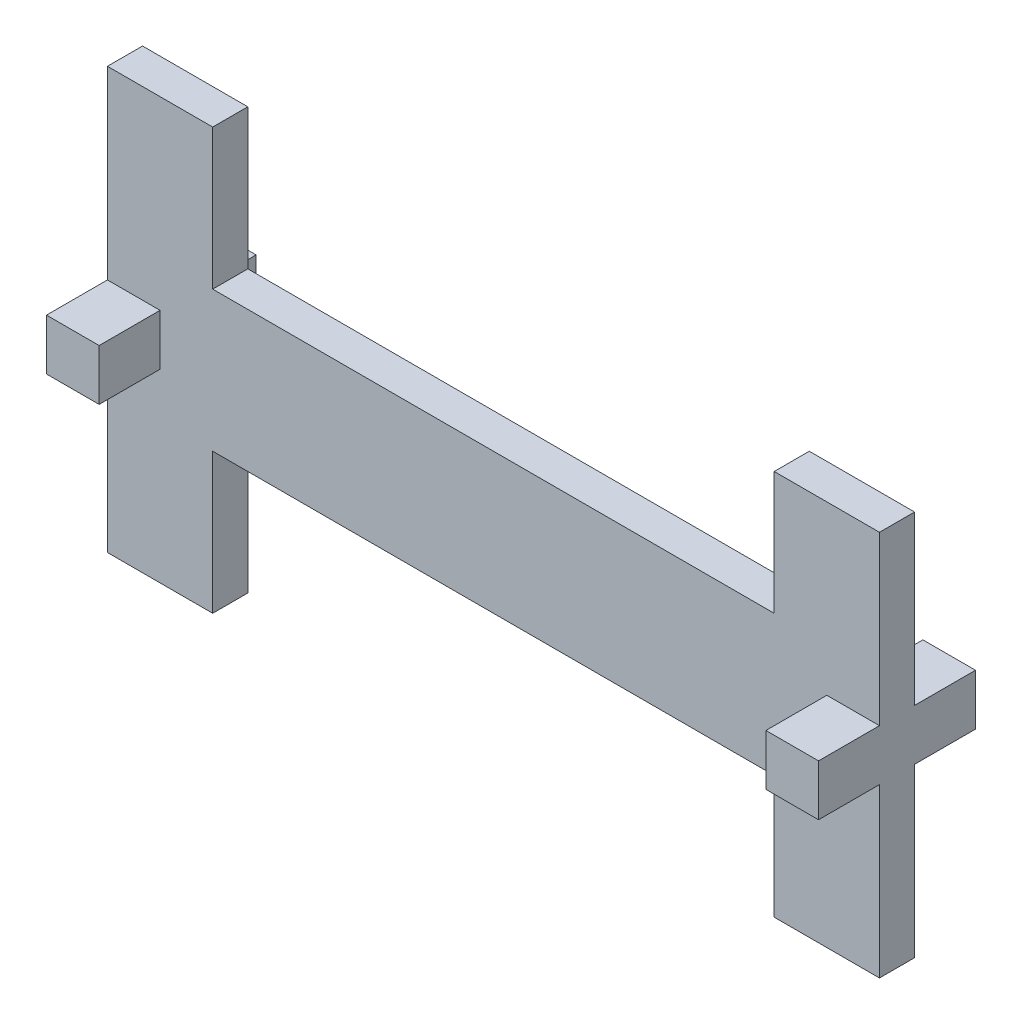
ISO-10303-21;
HEADER;
FILE_DESCRIPTION(('STEP AP214'),'2;1');
FILE_NAME('part.step','',(''),(''),'','','');
FILE_SCHEMA(('AUTOMOTIVE_DESIGN { 1 0 10303 214 1 1 1 1 }'));
ENDSEC;
DATA;
#1=APPLICATION_CONTEXT('core data for automotive mechanical design processes');
#2=APPLICATION_PROTOCOL_DEFINITION('international standard','automotive_design',2000,#1);
#3=PRODUCT_CONTEXT('',#1,'mechanical');
#4=PRODUCT('Part','Part','',(#3));
#5=PRODUCT_RELATED_PRODUCT_CATEGORY('part','',(#4));
#6=PRODUCT_DEFINITION_FORMATION('','',#4);
#7=PRODUCT_DEFINITION_CONTEXT('part definition',#1,'design');
#8=PRODUCT_DEFINITION('design','',#6,#7);
#9=PRODUCT_DEFINITION_SHAPE('','',#8);
#10=(LENGTH_UNIT() NAMED_UNIT(*) SI_UNIT(.MILLI.,.METRE.));
#11=(NAMED_UNIT(*) PLANE_ANGLE_UNIT() SI_UNIT($,.RADIAN.));
#12=(NAMED_UNIT(*) SI_UNIT($,.STERADIAN.) SOLID_ANGLE_UNIT());
#13=UNCERTAINTY_MEASURE_WITH_UNIT(LENGTH_MEASURE(1.E-05),#10,'distance_accuracy_value','');
#14=(GEOMETRIC_REPRESENTATION_CONTEXT(3) GLOBAL_UNCERTAINTY_ASSIGNED_CONTEXT((#13)) GLOBAL_UNIT_ASSIGNED_CONTEXT((#10,
#11,#12)) REPRESENTATION_CONTEXT('',''));
#15=CARTESIAN_POINT('',(0.,0.,0.));
#16=DIRECTION('',(0.,0.,1.));
#17=DIRECTION('',(1.,0.,0.));
#18=AXIS2_PLACEMENT_3D('',#15,#16,#17);
#19=CARTESIAN_POINT('',(0.,0.,10.));
#20=DIRECTION('',(0.,0.,-1.));
#21=DIRECTION('',(-1.,0.,0.));
#22=AXIS2_PLACEMENT_3D('',#19,#20,#21);
#23=PLANE('',#22);
#24=DIRECTION('',(0.,-1.,0.));
#25=VECTOR('',#24,1.);
#26=CARTESIAN_POINT('',(0.,0.,10.));
#27=LINE('',#26,#25);
#28=CARTESIAN_POINT('',(0.,52.73,10.));
#29=VERTEX_POINT('',#28);
#30=CARTESIAN_POINT('',(0.,0.,10.));
#31=VERTEX_POINT('',#30);
#32=EDGE_CURVE('E425',#29,#31,#27,.T.);
#33=ORIENTED_EDGE('',*,*,#32,.T.);
#34=DIRECTION('',(1.,0.,0.));
#35=VECTOR('',#34,1.);
#36=CARTESIAN_POINT('',(0.,0.,10.));
#37=LINE('',#36,#35);
#38=CARTESIAN_POINT('',(30.,0.,10.));
#39=VERTEX_POINT('',#38);
#40=EDGE_CURVE('E423',#31,#39,#37,.T.);
#41=ORIENTED_EDGE('',*,*,#40,.T.);
#42=DIRECTION('',(0.,1.,0.));
#43=VECTOR('',#42,1.);
#44=CARTESIAN_POINT('',(30.,0.,10.));
#45=LINE('',#44,#43);
#46=CARTESIAN_POINT('',(30.,40.,10.));
#47=VERTEX_POINT('',#46);
#48=EDGE_CURVE('E402',#39,#47,#45,.T.);
#49=ORIENTED_EDGE('',*,*,#48,.T.);
#50=DIRECTION('',(1.,0.,0.));
#51=VECTOR('',#50,1.);
#52=CARTESIAN_POINT('',(0.,40.,10.));
#53=LINE('',#52,#51);
#54=CARTESIAN_POINT('',(190.,40.,10.));
#55=VERTEX_POINT('',#54);
#56=EDGE_CURVE('E347',#47,#55,#53,.T.);
#57=ORIENTED_EDGE('',*,*,#56,.T.);
#58=DIRECTION('',(0.,-1.,0.));
#59=VECTOR('',#58,1.);
#60=CARTESIAN_POINT('',(190.,0.,10.));
#61=LINE('',#60,#59);
#62=CARTESIAN_POINT('',(190.,5.,10.));
#63=VERTEX_POINT('',#62);
#64=EDGE_CURVE('E395',#55,#63,#61,.T.);
#65=ORIENTED_EDGE('',*,*,#64,.T.);
#66=DIRECTION('',(1.,0.,0.));
#67=VECTOR('',#66,1.);
#68=CARTESIAN_POINT('',(0.,5.,10.));
#69=LINE('',#68,#67);
#70=CARTESIAN_POINT('',(220.,5.,10.));
#71=VERTEX_POINT('',#70);
#72=EDGE_CURVE('E404',#63,#71,#69,.T.);
#73=ORIENTED_EDGE('',*,*,#72,.T.);
#74=DIRECTION('',(0.,1.,0.));
#75=VECTOR('',#74,1.);
#76=CARTESIAN_POINT('',(220.,0.,10.));
#77=LINE('',#76,#75);
#78=CARTESIAN_POINT('',(220.,52.73,10.));
#79=VERTEX_POINT('',#78);
#80=EDGE_CURVE('E426',#71,#79,#77,.T.);
#81=ORIENTED_EDGE('',*,*,#80,.T.);
#82=DIRECTION('',(1.,0.,0.));
#83=VECTOR('',#82,1.);
#84=CARTESIAN_POINT('',(205.,52.73,10.));
#85=LINE('',#84,#83);
#86=CARTESIAN_POINT('',(205.,52.73,10.));
#87=VERTEX_POINT('',#86);
#88=EDGE_CURVE('E348',#87,#79,#85,.T.);
#89=ORIENTED_EDGE('',*,*,#88,.F.);
#90=DIRECTION('',(0.,-1.,0.));
#91=VECTOR('',#90,1.);
#92=CARTESIAN_POINT('',(205.,0.,10.));
#93=LINE('',#92,#91);
#94=CARTESIAN_POINT('',(205.,67.27,10.));
#95=VERTEX_POINT('',#94);
#96=EDGE_CURVE('E334',#95,#87,#93,.T.);
#97=ORIENTED_EDGE('',*,*,#96,.F.);
#98=DIRECTION('',(1.,0.,0.));
#99=VECTOR('',#98,1.);
#100=CARTESIAN_POINT('',(205.,67.27,10.));
#101=LINE('',#100,#99);
#102=CARTESIAN_POINT('',(220.,67.27,10.));
#103=VERTEX_POINT('',#102);
#104=EDGE_CURVE('E350',#95,#103,#101,.T.);
#105=ORIENTED_EDGE('',*,*,#104,.T.);
#106=CARTESIAN_POINT('',(220.,115.,10.));
#107=VERTEX_POINT('',#106);
#108=EDGE_CURVE('E422',#103,#107,#77,.T.);
#109=ORIENTED_EDGE('',*,*,#108,.T.);
#110=DIRECTION('',(1.,0.,0.));
#111=VECTOR('',#110,1.);
#112=CARTESIAN_POINT('',(0.,115.,10.));
#113=LINE('',#112,#111);
#114=CARTESIAN_POINT('',(190.,115.,10.));
#115=VERTEX_POINT('',#114);
#116=EDGE_CURVE('E367',#115,#107,#113,.T.);
#117=ORIENTED_EDGE('',*,*,#116,.F.);
#118=DIRECTION('',(0.,1.,0.));
#119=VECTOR('',#118,1.);
#120=CARTESIAN_POINT('',(190.,0.,10.));
#121=LINE('',#120,#119);
#122=CARTESIAN_POINT('',(190.,80.,10.));
#123=VERTEX_POINT('',#122);
#124=EDGE_CURVE('E370',#123,#115,#121,.T.);
#125=ORIENTED_EDGE('',*,*,#124,.F.);
#126=DIRECTION('',(1.,0.,0.));
#127=VECTOR('',#126,1.);
#128=CARTESIAN_POINT('',(0.,80.,10.));
#129=LINE('',#128,#127);
#130=CARTESIAN_POINT('',(30.,80.,10.));
#131=VERTEX_POINT('',#130);
#132=EDGE_CURVE('E360',#131,#123,#129,.T.);
#133=ORIENTED_EDGE('',*,*,#132,.F.);
#134=DIRECTION('',(0.,-1.,0.));
#135=VECTOR('',#134,1.);
#136=CARTESIAN_POINT('',(30.,0.,10.));
#137=LINE('',#136,#135);
#138=CARTESIAN_POINT('',(30.,120.,10.));
#139=VERTEX_POINT('',#138);
#140=EDGE_CURVE('E373',#139,#131,#137,.T.);
#141=ORIENTED_EDGE('',*,*,#140,.F.);
#142=DIRECTION('',(-1.,0.,0.));
#143=VECTOR('',#142,1.);
#144=CARTESIAN_POINT('',(0.,120.,10.));
#145=LINE('',#144,#143);
#146=CARTESIAN_POINT('',(0.,120.,10.));
#147=VERTEX_POINT('',#146);
#148=EDGE_CURVE('E427',#139,#147,#145,.T.);
#149=ORIENTED_EDGE('',*,*,#148,.T.);
#150=CARTESIAN_POINT('',(0.,67.27,10.));
#151=VERTEX_POINT('',#150);
#152=EDGE_CURVE('E420',#147,#151,#27,.T.);
#153=ORIENTED_EDGE('',*,*,#152,.T.);
#154=DIRECTION('',(-1.,0.,0.));
#155=VECTOR('',#154,1.);
#156=CARTESIAN_POINT('',(15.,67.27,10.));
#157=LINE('',#156,#155);
#158=CARTESIAN_POINT('',(15.,67.27,10.));
#159=VERTEX_POINT('',#158);
#160=EDGE_CURVE('E75',#159,#151,#157,.T.);
#161=ORIENTED_EDGE('',*,*,#160,.F.);
#162=DIRECTION('',(0.,-1.,0.));
#163=VECTOR('',#162,1.);
#164=CARTESIAN_POINT('',(15.,0.,10.));
#165=LINE('',#164,#163);
#166=CARTESIAN_POINT('',(15.,52.73,10.));
#167=VERTEX_POINT('',#166);
#168=EDGE_CURVE('E278',#159,#167,#165,.T.);
#169=ORIENTED_EDGE('',*,*,#168,.T.);
#170=DIRECTION('',(-1.,0.,0.));
#171=VECTOR('',#170,1.);
#172=CARTESIAN_POINT('',(15.,52.73,10.));
#173=LINE('',#172,#171);
#174=EDGE_CURVE('E294',#167,#29,#173,.T.);
#175=ORIENTED_EDGE('',*,*,#174,.T.);
#176=EDGE_LOOP('',(#33,#41,#49,#57,#65,#73,#81,#89,#97,#105,#109,#117,#125,#133,#141,#149,#153,
#161,#169,#175));
#177=FACE_BOUND('',#176,.T.);
#178=ADVANCED_FACE('F47',(#177),#23,.F.);
#179=CARTESIAN_POINT('',(0.,0.,10.));
#180=DIRECTION('',(0.,1.,0.));
#181=DIRECTION('',(0.,0.,1.));
#182=AXIS2_PLACEMENT_3D('',#179,#180,#181);
#183=PLANE('',#182);
#184=DIRECTION('',(0.,0.,1.));
#185=VECTOR('',#184,1.);
#186=CARTESIAN_POINT('',(30.,0.,0.));
#187=LINE('',#186,#185);
#188=CARTESIAN_POINT('',(30.,0.,0.));
#189=VERTEX_POINT('',#188);
#190=EDGE_CURVE('E413',#189,#39,#187,.T.);
#191=ORIENTED_EDGE('',*,*,#190,.T.);
#192=ORIENTED_EDGE('',*,*,#40,.F.);
#193=DIRECTION('',(0.,0.,-1.));
#194=VECTOR('',#193,1.);
#195=CARTESIAN_POINT('',(0.,0.,10.));
#196=LINE('',#195,#194);
#197=CARTESIAN_POINT('',(0.,0.,0.));
#198=VERTEX_POINT('',#197);
#199=EDGE_CURVE('E11',#31,#198,#196,.T.);
#200=ORIENTED_EDGE('',*,*,#199,.T.);
#201=DIRECTION('',(1.,0.,0.));
#202=VECTOR('',#201,1.);
#203=CARTESIAN_POINT('',(0.,0.,0.));
#204=LINE('',#203,#202);
#205=EDGE_CURVE('E435',#198,#189,#204,.T.);
#206=ORIENTED_EDGE('',*,*,#205,.T.);
#207=EDGE_LOOP('',(#191,#192,#200,#206));
#208=FACE_BOUND('',#207,.T.);
#209=ADVANCED_FACE('F459',(#208),#183,.F.);
#210=CARTESIAN_POINT('',(220.,0.,10.));
#211=DIRECTION('',(-1.,0.,0.));
#212=DIRECTION('',(0.,0.,1.));
#213=AXIS2_PLACEMENT_3D('',#210,#211,#212);
#214=PLANE('',#213);
#215=DIRECTION('',(0.,1.,0.));
#216=VECTOR('',#215,1.);
#217=CARTESIAN_POINT('',(220.,0.,0.));
#218=LINE('',#217,#216);
#219=CARTESIAN_POINT('',(220.,5.,0.));
#220=VERTEX_POINT('',#219);
#221=CARTESIAN_POINT('',(220.,52.73,0.));
#222=VERTEX_POINT('',#221);
#223=EDGE_CURVE('E436',#220,#222,#218,.T.);
#224=ORIENTED_EDGE('',*,*,#223,.T.);
#225=DIRECTION('',(0.,0.,-1.));
#226=VECTOR('',#225,1.);
#227=CARTESIAN_POINT('',(220.,52.73,0.));
#228=LINE('',#227,#226);
#229=CARTESIAN_POINT('',(220.,52.73,-17.365));
#230=VERTEX_POINT('',#229);
#231=EDGE_CURVE('E315',#222,#230,#228,.T.);
#232=ORIENTED_EDGE('',*,*,#231,.T.);
#233=DIRECTION('',(0.,-1.,0.));
#234=VECTOR('',#233,1.);
#235=CARTESIAN_POINT('',(220.,0.,-17.365));
#236=LINE('',#235,#234);
#237=CARTESIAN_POINT('',(220.,67.27,-17.365));
#238=VERTEX_POINT('',#237);
#239=EDGE_CURVE('E291',#238,#230,#236,.T.);
#240=ORIENTED_EDGE('',*,*,#239,.F.);
#241=DIRECTION('',(0.,0.,-1.));
#242=VECTOR('',#241,1.);
#243=CARTESIAN_POINT('',(220.,67.27,0.));
#244=LINE('',#243,#242);
#245=CARTESIAN_POINT('',(220.,67.27,0.));
#246=VERTEX_POINT('',#245);
#247=EDGE_CURVE('E308',#246,#238,#244,.T.);
#248=ORIENTED_EDGE('',*,*,#247,.F.);
#249=CARTESIAN_POINT('',(220.,115.,0.));
#250=VERTEX_POINT('',#249);
#251=EDGE_CURVE('E434',#246,#250,#218,.T.);
#252=ORIENTED_EDGE('',*,*,#251,.T.);
#253=DIRECTION('',(0.,0.,1.));
#254=VECTOR('',#253,1.);
#255=CARTESIAN_POINT('',(220.,115.,0.));
#256=LINE('',#255,#254);
#257=EDGE_CURVE('E384',#250,#107,#256,.T.);
#258=ORIENTED_EDGE('',*,*,#257,.T.);
#259=ORIENTED_EDGE('',*,*,#108,.F.);
#260=DIRECTION('',(0.,0.,-1.));
#261=VECTOR('',#260,1.);
#262=CARTESIAN_POINT('',(220.,67.27,0.));
#263=LINE('',#262,#261);
#264=CARTESIAN_POINT('',(220.,67.27,27.365));
#265=VERTEX_POINT('',#264);
#266=EDGE_CURVE('E329',#265,#103,#263,.T.);
#267=ORIENTED_EDGE('',*,*,#266,.F.);
#268=DIRECTION('',(0.,-1.,0.));
#269=VECTOR('',#268,1.);
#270=CARTESIAN_POINT('',(220.,0.,27.365));
#271=LINE('',#270,#269);
#272=CARTESIAN_POINT('',(220.,52.73,27.365));
#273=VERTEX_POINT('',#272);
#274=EDGE_CURVE('E312',#265,#273,#271,.T.);
#275=ORIENTED_EDGE('',*,*,#274,.T.);
#276=DIRECTION('',(0.,0.,-1.));
#277=VECTOR('',#276,1.);
#278=CARTESIAN_POINT('',(220.,52.73,0.));
#279=LINE('',#278,#277);
#280=EDGE_CURVE('E339',#273,#79,#279,.T.);
#281=ORIENTED_EDGE('',*,*,#280,.T.);
#282=ORIENTED_EDGE('',*,*,#80,.F.);
#283=DIRECTION('',(0.,0.,1.));
#284=VECTOR('',#283,1.);
#285=CARTESIAN_POINT('',(220.,5.,0.));
#286=LINE('',#285,#284);
#287=EDGE_CURVE('E415',#220,#71,#286,.T.);
#288=ORIENTED_EDGE('',*,*,#287,.F.);
#289=EDGE_LOOP('',(#224,#232,#240,#248,#252,#258,#259,#267,#275,#281,#282,#288));
#290=FACE_BOUND('',#289,.T.);
#291=ADVANCED_FACE('F493',(#290),#214,.F.);
#292=CARTESIAN_POINT('',(0.,0.,0.));
#293=DIRECTION('',(0.,0.,-1.));
#294=DIRECTION('',(-1.,0.,0.));
#295=AXIS2_PLACEMENT_3D('',#292,#293,#294);
#296=PLANE('',#295);
#297=ORIENTED_EDGE('',*,*,#205,.F.);
#298=DIRECTION('',(0.,-1.,0.));
#299=VECTOR('',#298,1.);
#300=CARTESIAN_POINT('',(0.,0.,0.));
#301=LINE('',#300,#299);
#302=CARTESIAN_POINT('',(0.,52.73,0.));
#303=VERTEX_POINT('',#302);
#304=EDGE_CURVE('E379',#303,#198,#301,.T.);
#305=ORIENTED_EDGE('',*,*,#304,.F.);
#306=DIRECTION('',(-1.,0.,0.));
#307=VECTOR('',#306,1.);
#308=CARTESIAN_POINT('',(15.,52.73,0.));
#309=LINE('',#308,#307);
#310=CARTESIAN_POINT('',(15.,52.73,0.));
#311=VERTEX_POINT('',#310);
#312=EDGE_CURVE('E262',#311,#303,#309,.T.);
#313=ORIENTED_EDGE('',*,*,#312,.F.);
#314=DIRECTION('',(0.,1.,0.));
#315=VECTOR('',#314,1.);
#316=CARTESIAN_POINT('',(15.,0.,0.));
#317=LINE('',#316,#315);
#318=CARTESIAN_POINT('',(15.,67.27,0.));
#319=VERTEX_POINT('',#318);
#320=EDGE_CURVE('E244',#311,#319,#317,.T.);
#321=ORIENTED_EDGE('',*,*,#320,.T.);
#322=DIRECTION('',(-1.,0.,0.));
#323=VECTOR('',#322,1.);
#324=CARTESIAN_POINT('',(15.,67.27,0.));
#325=LINE('',#324,#323);
#326=CARTESIAN_POINT('',(0.,67.27,0.));
#327=VERTEX_POINT('',#326);
#328=EDGE_CURVE('E264',#319,#327,#325,.T.);
#329=ORIENTED_EDGE('',*,*,#328,.T.);
#330=CARTESIAN_POINT('',(0.,120.,0.));
#331=VERTEX_POINT('',#330);
#332=EDGE_CURVE('E258',#331,#327,#301,.T.);
#333=ORIENTED_EDGE('',*,*,#332,.F.);
#334=DIRECTION('',(-1.,0.,0.));
#335=VECTOR('',#334,1.);
#336=CARTESIAN_POINT('',(0.,120.,0.));
#337=LINE('',#336,#335);
#338=CARTESIAN_POINT('',(30.,120.,0.));
#339=VERTEX_POINT('',#338);
#340=EDGE_CURVE('E438',#339,#331,#337,.T.);
#341=ORIENTED_EDGE('',*,*,#340,.F.);
#342=DIRECTION('',(0.,-1.,0.));
#343=VECTOR('',#342,1.);
#344=CARTESIAN_POINT('',(30.,0.,0.));
#345=LINE('',#344,#343);
#346=CARTESIAN_POINT('',(30.,80.,0.));
#347=VERTEX_POINT('',#346);
#348=EDGE_CURVE('E358',#339,#347,#345,.T.);
#349=ORIENTED_EDGE('',*,*,#348,.T.);
#350=DIRECTION('',(1.,0.,0.));
#351=VECTOR('',#350,1.);
#352=CARTESIAN_POINT('',(0.,80.,0.));
#353=LINE('',#352,#351);
#354=CARTESIAN_POINT('',(190.,80.,0.));
#355=VERTEX_POINT('',#354);
#356=EDGE_CURVE('E361',#347,#355,#353,.T.);
#357=ORIENTED_EDGE('',*,*,#356,.T.);
#358=DIRECTION('',(0.,1.,0.));
#359=VECTOR('',#358,1.);
#360=CARTESIAN_POINT('',(190.,0.,0.));
#361=LINE('',#360,#359);
#362=CARTESIAN_POINT('',(190.,115.,0.));
#363=VERTEX_POINT('',#362);
#364=EDGE_CURVE('E351',#355,#363,#361,.T.);
#365=ORIENTED_EDGE('',*,*,#364,.T.);
#366=DIRECTION('',(1.,0.,0.));
#367=VECTOR('',#366,1.);
#368=CARTESIAN_POINT('',(0.,115.,0.));
#369=LINE('',#368,#367);
#370=EDGE_CURVE('E357',#363,#250,#369,.T.);
#371=ORIENTED_EDGE('',*,*,#370,.T.);
#372=ORIENTED_EDGE('',*,*,#251,.F.);
#373=DIRECTION('',(1.,0.,0.));
#374=VECTOR('',#373,1.);
#375=CARTESIAN_POINT('',(205.,67.27,0.));
#376=LINE('',#375,#374);
#377=CARTESIAN_POINT('',(205.,67.27,0.));
#378=VERTEX_POINT('',#377);
#379=EDGE_CURVE('E304',#378,#246,#376,.T.);
#380=ORIENTED_EDGE('',*,*,#379,.F.);
#381=DIRECTION('',(0.,1.,0.));
#382=VECTOR('',#381,1.);
#383=CARTESIAN_POINT('',(205.,0.,0.));
#384=LINE('',#383,#382);
#385=CARTESIAN_POINT('',(205.,52.73,0.));
#386=VERTEX_POINT('',#385);
#387=EDGE_CURVE('E325',#386,#378,#384,.T.);
#388=ORIENTED_EDGE('',*,*,#387,.F.);
#389=DIRECTION('',(1.,0.,0.));
#390=VECTOR('',#389,1.);
#391=CARTESIAN_POINT('',(205.,52.73,0.));
#392=LINE('',#391,#390);
#393=EDGE_CURVE('E307',#386,#222,#392,.T.);
#394=ORIENTED_EDGE('',*,*,#393,.T.);
#395=ORIENTED_EDGE('',*,*,#223,.F.);
#396=DIRECTION('',(1.,0.,0.));
#397=VECTOR('',#396,1.);
#398=CARTESIAN_POINT('',(0.,5.,0.));
#399=LINE('',#398,#397);
#400=CARTESIAN_POINT('',(190.,5.,0.));
#401=VERTEX_POINT('',#400);
#402=EDGE_CURVE('E392',#401,#220,#399,.T.);
#403=ORIENTED_EDGE('',*,*,#402,.F.);
#404=DIRECTION('',(0.,-1.,0.));
#405=VECTOR('',#404,1.);
#406=CARTESIAN_POINT('',(190.,0.,0.));
#407=LINE('',#406,#405);
#408=CARTESIAN_POINT('',(190.,40.,0.));
#409=VERTEX_POINT('',#408);
#410=EDGE_CURVE('E397',#409,#401,#407,.T.);
#411=ORIENTED_EDGE('',*,*,#410,.F.);
#412=DIRECTION('',(1.,0.,0.));
#413=VECTOR('',#412,1.);
#414=CARTESIAN_POINT('',(0.,40.,0.));
#415=LINE('',#414,#413);
#416=CARTESIAN_POINT('',(30.,40.,0.));
#417=VERTEX_POINT('',#416);
#418=EDGE_CURVE('E386',#417,#409,#415,.T.);
#419=ORIENTED_EDGE('',*,*,#418,.F.);
#420=DIRECTION('',(0.,1.,0.));
#421=VECTOR('',#420,1.);
#422=CARTESIAN_POINT('',(30.,0.,0.));
#423=LINE('',#422,#421);
#424=EDGE_CURVE('E393',#189,#417,#423,.T.);
#425=ORIENTED_EDGE('',*,*,#424,.F.);
#426=EDGE_LOOP('',(#297,#305,#313,#321,#329,#333,#341,#349,#357,#365,#371,#372,#380,#388,#394,
#395,#403,#411,#419,#425));
#427=FACE_BOUND('',#426,.T.);
#428=ADVANCED_FACE('F450',(#427),#296,.T.);
#429=CARTESIAN_POINT('',(0.,0.,10.));
#430=DIRECTION('',(1.,0.,0.));
#431=DIRECTION('',(0.,0.,-1.));
#432=AXIS2_PLACEMENT_3D('',#429,#430,#431);
#433=PLANE('',#432);
#434=DIRECTION('',(0.,0.,-1.));
#435=VECTOR('',#434,1.);
#436=CARTESIAN_POINT('',(0.,52.73,0.));
#437=LINE('',#436,#435);
#438=CARTESIAN_POINT('',(0.,52.73,-17.365));
#439=VERTEX_POINT('',#438);
#440=EDGE_CURVE('E62',#303,#439,#437,.T.);
#441=ORIENTED_EDGE('',*,*,#440,.F.);
#442=ORIENTED_EDGE('',*,*,#304,.T.);
#443=ORIENTED_EDGE('',*,*,#199,.F.);
#444=ORIENTED_EDGE('',*,*,#32,.F.);
#445=DIRECTION('',(0.,0.,-1.));
#446=VECTOR('',#445,1.);
#447=CARTESIAN_POINT('',(0.,52.73,0.));
#448=LINE('',#447,#446);
#449=CARTESIAN_POINT('',(0.,52.73,27.365));
#450=VERTEX_POINT('',#449);
#451=EDGE_CURVE('E280',#450,#29,#448,.T.);
#452=ORIENTED_EDGE('',*,*,#451,.F.);
#453=DIRECTION('',(0.,-1.,0.));
#454=VECTOR('',#453,1.);
#455=CARTESIAN_POINT('',(0.,0.,27.365));
#456=LINE('',#455,#454);
#457=CARTESIAN_POINT('',(0.,67.27,27.365));
#458=VERTEX_POINT('',#457);
#459=EDGE_CURVE('E260',#458,#450,#456,.T.);
#460=ORIENTED_EDGE('',*,*,#459,.F.);
#461=DIRECTION('',(0.,0.,-1.));
#462=VECTOR('',#461,1.);
#463=CARTESIAN_POINT('',(0.,67.27,0.));
#464=LINE('',#463,#462);
#465=EDGE_CURVE('E257',#458,#151,#464,.T.);
#466=ORIENTED_EDGE('',*,*,#465,.T.);
#467=ORIENTED_EDGE('',*,*,#152,.F.);
#468=DIRECTION('',(0.,0.,-1.));
#469=VECTOR('',#468,1.);
#470=CARTESIAN_POINT('',(0.,120.,10.));
#471=LINE('',#470,#469);
#472=EDGE_CURVE('E60',#147,#331,#471,.T.);
#473=ORIENTED_EDGE('',*,*,#472,.T.);
#474=ORIENTED_EDGE('',*,*,#332,.T.);
#475=DIRECTION('',(0.,0.,-1.));
#476=VECTOR('',#475,1.);
#477=CARTESIAN_POINT('',(0.,67.27,0.));
#478=LINE('',#477,#476);
#479=CARTESIAN_POINT('',(0.,67.27,-17.365));
#480=VERTEX_POINT('',#479);
#481=EDGE_CURVE('E236',#327,#480,#478,.T.);
#482=ORIENTED_EDGE('',*,*,#481,.T.);
#483=DIRECTION('',(0.,-1.,0.));
#484=VECTOR('',#483,1.);
#485=CARTESIAN_POINT('',(0.,0.,-17.365));
#486=LINE('',#485,#484);
#487=EDGE_CURVE('E250',#480,#439,#486,.T.);
#488=ORIENTED_EDGE('',*,*,#487,.T.);
#489=EDGE_LOOP('',(#441,#442,#443,#444,#452,#460,#466,#467,#473,#474,#482,#488));
#490=FACE_BOUND('',#489,.T.);
#491=ADVANCED_FACE('F51',(#490),#433,.F.);
#492=CARTESIAN_POINT('',(0.,120.,10.));
#493=DIRECTION('',(0.,-1.,0.));
#494=DIRECTION('',(0.,0.,-1.));
#495=AXIS2_PLACEMENT_3D('',#492,#493,#494);
#496=PLANE('',#495);
#497=ORIENTED_EDGE('',*,*,#148,.F.);
#498=DIRECTION('',(0.,0.,1.));
#499=VECTOR('',#498,1.);
#500=CARTESIAN_POINT('',(30.,120.,0.));
#501=LINE('',#500,#499);
#502=EDGE_CURVE('E382',#339,#139,#501,.T.);
#503=ORIENTED_EDGE('',*,*,#502,.F.);
#504=ORIENTED_EDGE('',*,*,#340,.T.);
#505=ORIENTED_EDGE('',*,*,#472,.F.);
#506=EDGE_LOOP('',(#497,#503,#504,#505));
#507=FACE_BOUND('',#506,.T.);
#508=ADVANCED_FACE('F498',(#507),#496,.F.);
#509=CARTESIAN_POINT('',(0.,40.,0.));
#510=DIRECTION('',(0.,-1.,0.));
#511=DIRECTION('',(0.,0.,-1.));
#512=AXIS2_PLACEMENT_3D('',#509,#510,#511);
#513=PLANE('',#512);
#514=ORIENTED_EDGE('',*,*,#56,.F.);
#515=DIRECTION('',(0.,0.,1.));
#516=VECTOR('',#515,1.);
#517=CARTESIAN_POINT('',(30.,40.,0.));
#518=LINE('',#517,#516);
#519=EDGE_CURVE('E399',#417,#47,#518,.T.);
#520=ORIENTED_EDGE('',*,*,#519,.F.);
#521=ORIENTED_EDGE('',*,*,#418,.T.);
#522=DIRECTION('',(0.,0.,1.));
#523=VECTOR('',#522,1.);
#524=CARTESIAN_POINT('',(190.,40.,0.));
#525=LINE('',#524,#523);
#526=EDGE_CURVE('E371',#409,#55,#525,.T.);
#527=ORIENTED_EDGE('',*,*,#526,.T.);
#528=EDGE_LOOP('',(#514,#520,#521,#527));
#529=FACE_BOUND('',#528,.T.);
#530=ADVANCED_FACE('F500',(#529),#513,.T.);
#531=CARTESIAN_POINT('',(190.,0.,0.));
#532=DIRECTION('',(-1.,0.,0.));
#533=DIRECTION('',(0.,0.,1.));
#534=AXIS2_PLACEMENT_3D('',#531,#532,#533);
#535=PLANE('',#534);
#536=ORIENTED_EDGE('',*,*,#64,.F.);
#537=ORIENTED_EDGE('',*,*,#526,.F.);
#538=ORIENTED_EDGE('',*,*,#410,.T.);
#539=DIRECTION('',(0.,0.,1.));
#540=VECTOR('',#539,1.);
#541=CARTESIAN_POINT('',(190.,5.,0.));
#542=LINE('',#541,#540);
#543=EDGE_CURVE('E409',#401,#63,#542,.T.);
#544=ORIENTED_EDGE('',*,*,#543,.T.);
#545=EDGE_LOOP('',(#536,#537,#538,#544));
#546=FACE_BOUND('',#545,.T.);
#547=ADVANCED_FACE('F558',(#546),#535,.T.);
#548=CARTESIAN_POINT('',(0.,5.,0.));
#549=DIRECTION('',(0.,-1.,0.));
#550=DIRECTION('',(0.,0.,-1.));
#551=AXIS2_PLACEMENT_3D('',#548,#549,#550);
#552=PLANE('',#551);
#553=ORIENTED_EDGE('',*,*,#287,.T.);
#554=ORIENTED_EDGE('',*,*,#72,.F.);
#555=ORIENTED_EDGE('',*,*,#543,.F.);
#556=ORIENTED_EDGE('',*,*,#402,.T.);
#557=EDGE_LOOP('',(#553,#554,#555,#556));
#558=FACE_BOUND('',#557,.T.);
#559=ADVANCED_FACE('F551',(#558),#552,.T.);
#560=CARTESIAN_POINT('',(30.,0.,0.));
#561=DIRECTION('',(1.,0.,0.));
#562=DIRECTION('',(0.,1.,0.));
#563=AXIS2_PLACEMENT_3D('',#560,#561,#562);
#564=PLANE('',#563);
#565=ORIENTED_EDGE('',*,*,#48,.F.);
#566=ORIENTED_EDGE('',*,*,#190,.F.);
#567=ORIENTED_EDGE('',*,*,#424,.T.);
#568=ORIENTED_EDGE('',*,*,#519,.T.);
#569=EDGE_LOOP('',(#565,#566,#567,#568));
#570=FACE_BOUND('',#569,.T.);
#571=ADVANCED_FACE('F564',(#570),#564,.T.);
#572=CARTESIAN_POINT('',(190.,0.,0.));
#573=DIRECTION('',(1.,0.,0.));
#574=DIRECTION('',(0.,0.,-1.));
#575=AXIS2_PLACEMENT_3D('',#572,#573,#574);
#576=PLANE('',#575);
#577=ORIENTED_EDGE('',*,*,#124,.T.);
#578=DIRECTION('',(0.,0.,1.));
#579=VECTOR('',#578,1.);
#580=CARTESIAN_POINT('',(190.,115.,0.));
#581=LINE('',#580,#579);
#582=EDGE_CURVE('E368',#363,#115,#581,.T.);
#583=ORIENTED_EDGE('',*,*,#582,.F.);
#584=ORIENTED_EDGE('',*,*,#364,.F.);
#585=DIRECTION('',(0.,0.,1.));
#586=VECTOR('',#585,1.);
#587=CARTESIAN_POINT('',(190.,80.,0.));
#588=LINE('',#587,#586);
#589=EDGE_CURVE('E378',#355,#123,#588,.T.);
#590=ORIENTED_EDGE('',*,*,#589,.T.);
#591=EDGE_LOOP('',(#577,#583,#584,#590));
#592=FACE_BOUND('',#591,.T.);
#593=ADVANCED_FACE('F563',(#592),#576,.F.);
#594=CARTESIAN_POINT('',(0.,80.,0.));
#595=DIRECTION('',(0.,-1.,0.));
#596=DIRECTION('',(0.,0.,-1.));
#597=AXIS2_PLACEMENT_3D('',#594,#595,#596);
#598=PLANE('',#597);
#599=ORIENTED_EDGE('',*,*,#132,.T.);
#600=ORIENTED_EDGE('',*,*,#589,.F.);
#601=ORIENTED_EDGE('',*,*,#356,.F.);
#602=DIRECTION('',(0.,0.,1.));
#603=VECTOR('',#602,1.);
#604=CARTESIAN_POINT('',(30.,80.,0.));
#605=LINE('',#604,#603);
#606=EDGE_CURVE('E381',#347,#131,#605,.T.);
#607=ORIENTED_EDGE('',*,*,#606,.T.);
#608=EDGE_LOOP('',(#599,#600,#601,#607));
#609=FACE_BOUND('',#608,.T.);
#610=ADVANCED_FACE('F568',(#609),#598,.F.);
#611=CARTESIAN_POINT('',(30.,0.,0.));
#612=DIRECTION('',(-1.,0.,0.));
#613=DIRECTION('',(0.,-1.,0.));
#614=AXIS2_PLACEMENT_3D('',#611,#612,#613);
#615=PLANE('',#614);
#616=ORIENTED_EDGE('',*,*,#140,.T.);
#617=ORIENTED_EDGE('',*,*,#606,.F.);
#618=ORIENTED_EDGE('',*,*,#348,.F.);
#619=ORIENTED_EDGE('',*,*,#502,.T.);
#620=EDGE_LOOP('',(#616,#617,#618,#619));
#621=FACE_BOUND('',#620,.T.);
#622=ADVANCED_FACE('F576',(#621),#615,.F.);
#623=CARTESIAN_POINT('',(0.,115.,0.));
#624=DIRECTION('',(0.,-1.,0.));
#625=DIRECTION('',(0.,0.,-1.));
#626=AXIS2_PLACEMENT_3D('',#623,#624,#625);
#627=PLANE('',#626);
#628=ORIENTED_EDGE('',*,*,#257,.F.);
#629=ORIENTED_EDGE('',*,*,#370,.F.);
#630=ORIENTED_EDGE('',*,*,#582,.T.);
#631=ORIENTED_EDGE('',*,*,#116,.T.);
#632=EDGE_LOOP('',(#628,#629,#630,#631));
#633=FACE_BOUND('',#632,.T.);
#634=ADVANCED_FACE('F531',(#633),#627,.F.);
#635=CARTESIAN_POINT('',(205.,0.,27.365));
#636=DIRECTION('',(0.,0.,1.));
#637=DIRECTION('',(1.,0.,0.));
#638=AXIS2_PLACEMENT_3D('',#635,#636,#637);
#639=PLANE('',#638);
#640=ORIENTED_EDGE('',*,*,#274,.F.);
#641=DIRECTION('',(1.,0.,0.));
#642=VECTOR('',#641,1.);
#643=CARTESIAN_POINT('',(205.,67.27,27.365));
#644=LINE('',#643,#642);
#645=CARTESIAN_POINT('',(205.,67.27,27.365));
#646=VERTEX_POINT('',#645);
#647=EDGE_CURVE('E341',#646,#265,#644,.T.);
#648=ORIENTED_EDGE('',*,*,#647,.F.);
#649=DIRECTION('',(0.,-1.,0.));
#650=VECTOR('',#649,1.);
#651=CARTESIAN_POINT('',(205.,0.,27.365));
#652=LINE('',#651,#650);
#653=CARTESIAN_POINT('',(205.,52.73,27.365));
#654=VERTEX_POINT('',#653);
#655=EDGE_CURVE('E326',#646,#654,#652,.T.);
#656=ORIENTED_EDGE('',*,*,#655,.T.);
#657=DIRECTION('',(1.,0.,0.));
#658=VECTOR('',#657,1.);
#659=CARTESIAN_POINT('',(205.,52.73,27.365));
#660=LINE('',#659,#658);
#661=EDGE_CURVE('E340',#654,#273,#660,.T.);
#662=ORIENTED_EDGE('',*,*,#661,.T.);
#663=EDGE_LOOP('',(#640,#648,#656,#662));
#664=FACE_BOUND('',#663,.T.);
#665=ADVANCED_FACE('F547',(#664),#639,.T.);
#666=CARTESIAN_POINT('',(205.,67.27,0.));
#667=DIRECTION('',(0.,-1.,0.));
#668=DIRECTION('',(0.,0.,-1.));
#669=AXIS2_PLACEMENT_3D('',#666,#667,#668);
#670=PLANE('',#669);
#671=ORIENTED_EDGE('',*,*,#266,.T.);
#672=ORIENTED_EDGE('',*,*,#104,.F.);
#673=DIRECTION('',(0.,0.,-1.));
#674=VECTOR('',#673,1.);
#675=CARTESIAN_POINT('',(205.,67.27,0.));
#676=LINE('',#675,#674);
#677=EDGE_CURVE('E333',#646,#95,#676,.T.);
#678=ORIENTED_EDGE('',*,*,#677,.F.);
#679=ORIENTED_EDGE('',*,*,#647,.T.);
#680=EDGE_LOOP('',(#671,#672,#678,#679));
#681=FACE_BOUND('',#680,.T.);
#682=ADVANCED_FACE('F544',(#681),#670,.F.);
#683=CARTESIAN_POINT('',(205.,52.73,0.));
#684=DIRECTION('',(0.,-1.,0.));
#685=DIRECTION('',(0.,0.,-1.));
#686=AXIS2_PLACEMENT_3D('',#683,#684,#685);
#687=PLANE('',#686);
#688=ORIENTED_EDGE('',*,*,#280,.F.);
#689=ORIENTED_EDGE('',*,*,#661,.F.);
#690=DIRECTION('',(0.,0.,-1.));
#691=VECTOR('',#690,1.);
#692=CARTESIAN_POINT('',(205.,52.73,0.));
#693=LINE('',#692,#691);
#694=EDGE_CURVE('E328',#654,#87,#693,.T.);
#695=ORIENTED_EDGE('',*,*,#694,.T.);
#696=ORIENTED_EDGE('',*,*,#88,.T.);
#697=EDGE_LOOP('',(#688,#689,#695,#696));
#698=FACE_BOUND('',#697,.T.);
#699=ADVANCED_FACE('F586',(#698),#687,.T.);
#700=CARTESIAN_POINT('',(205.,0.,0.));
#701=DIRECTION('',(1.,0.,0.));
#702=DIRECTION('',(0.,0.,-1.));
#703=AXIS2_PLACEMENT_3D('',#700,#701,#702);
#704=PLANE('',#703);
#705=ORIENTED_EDGE('',*,*,#655,.F.);
#706=ORIENTED_EDGE('',*,*,#677,.T.);
#707=ORIENTED_EDGE('',*,*,#96,.T.);
#708=ORIENTED_EDGE('',*,*,#694,.F.);
#709=EDGE_LOOP('',(#705,#706,#707,#708));
#710=FACE_BOUND('',#709,.T.);
#711=ADVANCED_FACE('F591',(#710),#704,.F.);
#712=CARTESIAN_POINT('',(205.,0.,-17.365));
#713=DIRECTION('',(0.,0.,1.));
#714=DIRECTION('',(1.,0.,0.));
#715=AXIS2_PLACEMENT_3D('',#712,#713,#714);
#716=PLANE('',#715);
#717=ORIENTED_EDGE('',*,*,#239,.T.);
#718=DIRECTION('',(1.,0.,0.));
#719=VECTOR('',#718,1.);
#720=CARTESIAN_POINT('',(205.,52.73,-17.365));
#721=LINE('',#720,#719);
#722=CARTESIAN_POINT('',(205.,52.73,-17.365));
#723=VERTEX_POINT('',#722);
#724=EDGE_CURVE('E309',#723,#230,#721,.T.);
#725=ORIENTED_EDGE('',*,*,#724,.F.);
#726=DIRECTION('',(0.,-1.,0.));
#727=VECTOR('',#726,1.);
#728=CARTESIAN_POINT('',(205.,0.,-17.365));
#729=LINE('',#728,#727);
#730=CARTESIAN_POINT('',(205.,67.27,-17.365));
#731=VERTEX_POINT('',#730);
#732=EDGE_CURVE('E303',#731,#723,#729,.T.);
#733=ORIENTED_EDGE('',*,*,#732,.F.);
#734=DIRECTION('',(1.,0.,0.));
#735=VECTOR('',#734,1.);
#736=CARTESIAN_POINT('',(205.,67.27,-17.365));
#737=LINE('',#736,#735);
#738=EDGE_CURVE('E297',#731,#238,#737,.T.);
#739=ORIENTED_EDGE('',*,*,#738,.T.);
#740=EDGE_LOOP('',(#717,#725,#733,#739));
#741=FACE_BOUND('',#740,.T.);
#742=ADVANCED_FACE('F523',(#741),#716,.F.);
#743=CARTESIAN_POINT('',(205.,52.73,0.));
#744=DIRECTION('',(0.,-1.,0.));
#745=DIRECTION('',(0.,0.,-1.));
#746=AXIS2_PLACEMENT_3D('',#743,#744,#745);
#747=PLANE('',#746);
#748=ORIENTED_EDGE('',*,*,#231,.F.);
#749=ORIENTED_EDGE('',*,*,#393,.F.);
#750=DIRECTION('',(0.,0.,-1.));
#751=VECTOR('',#750,1.);
#752=CARTESIAN_POINT('',(205.,52.73,0.));
#753=LINE('',#752,#751);
#754=EDGE_CURVE('E305',#386,#723,#753,.T.);
#755=ORIENTED_EDGE('',*,*,#754,.T.);
#756=ORIENTED_EDGE('',*,*,#724,.T.);
#757=EDGE_LOOP('',(#748,#749,#755,#756));
#758=FACE_BOUND('',#757,.T.);
#759=ADVANCED_FACE('F517',(#758),#747,.T.);
#760=CARTESIAN_POINT('',(205.,67.27,0.));
#761=DIRECTION('',(0.,-1.,0.));
#762=DIRECTION('',(0.,0.,-1.));
#763=AXIS2_PLACEMENT_3D('',#760,#761,#762);
#764=PLANE('',#763);
#765=ORIENTED_EDGE('',*,*,#247,.T.);
#766=ORIENTED_EDGE('',*,*,#738,.F.);
#767=DIRECTION('',(0.,0.,-1.));
#768=VECTOR('',#767,1.);
#769=CARTESIAN_POINT('',(205.,67.27,0.));
#770=LINE('',#769,#768);
#771=EDGE_CURVE('E316',#378,#731,#770,.T.);
#772=ORIENTED_EDGE('',*,*,#771,.F.);
#773=ORIENTED_EDGE('',*,*,#379,.T.);
#774=EDGE_LOOP('',(#765,#766,#772,#773));
#775=FACE_BOUND('',#774,.T.);
#776=ADVANCED_FACE('F483',(#775),#764,.F.);
#777=CARTESIAN_POINT('',(205.,0.,0.));
#778=DIRECTION('',(1.,0.,0.));
#779=DIRECTION('',(0.,0.,-1.));
#780=AXIS2_PLACEMENT_3D('',#777,#778,#779);
#781=PLANE('',#780);
#782=ORIENTED_EDGE('',*,*,#732,.T.);
#783=ORIENTED_EDGE('',*,*,#754,.F.);
#784=ORIENTED_EDGE('',*,*,#387,.T.);
#785=ORIENTED_EDGE('',*,*,#771,.T.);
#786=EDGE_LOOP('',(#782,#783,#784,#785));
#787=FACE_BOUND('',#786,.T.);
#788=ADVANCED_FACE('F474',(#787),#781,.F.);
#789=CARTESIAN_POINT('',(15.,0.,27.365));
#790=DIRECTION('',(0.,0.,-1.));
#791=DIRECTION('',(-1.,0.,0.));
#792=AXIS2_PLACEMENT_3D('',#789,#790,#791);
#793=PLANE('',#792);
#794=ORIENTED_EDGE('',*,*,#459,.T.);
#795=DIRECTION('',(-1.,0.,0.));
#796=VECTOR('',#795,1.);
#797=CARTESIAN_POINT('',(15.,52.73,27.365));
#798=LINE('',#797,#796);
#799=CARTESIAN_POINT('',(15.,52.73,27.365));
#800=VERTEX_POINT('',#799);
#801=EDGE_CURVE('E288',#800,#450,#798,.T.);
#802=ORIENTED_EDGE('',*,*,#801,.F.);
#803=DIRECTION('',(0.,-1.,0.));
#804=VECTOR('',#803,1.);
#805=CARTESIAN_POINT('',(15.,0.,27.365));
#806=LINE('',#805,#804);
#807=CARTESIAN_POINT('',(15.,67.27,27.365));
#808=VERTEX_POINT('',#807);
#809=EDGE_CURVE('E272',#808,#800,#806,.T.);
#810=ORIENTED_EDGE('',*,*,#809,.F.);
#811=DIRECTION('',(-1.,0.,0.));
#812=VECTOR('',#811,1.);
#813=CARTESIAN_POINT('',(15.,67.27,27.365));
#814=LINE('',#813,#812);
#815=EDGE_CURVE('E282',#808,#458,#814,.T.);
#816=ORIENTED_EDGE('',*,*,#815,.T.);
#817=EDGE_LOOP('',(#794,#802,#810,#816));
#818=FACE_BOUND('',#817,.T.);
#819=ADVANCED_FACE('F471',(#818),#793,.F.);
#820=CARTESIAN_POINT('',(15.,52.73,0.));
#821=DIRECTION('',(0.,1.,0.));
#822=DIRECTION('',(0.,0.,1.));
#823=AXIS2_PLACEMENT_3D('',#820,#821,#822);
#824=PLANE('',#823);
#825=ORIENTED_EDGE('',*,*,#451,.T.);
#826=ORIENTED_EDGE('',*,*,#174,.F.);
#827=DIRECTION('',(0.,0.,-1.));
#828=VECTOR('',#827,1.);
#829=CARTESIAN_POINT('',(15.,52.73,0.));
#830=LINE('',#829,#828);
#831=EDGE_CURVE('E285',#800,#167,#830,.T.);
#832=ORIENTED_EDGE('',*,*,#831,.F.);
#833=ORIENTED_EDGE('',*,*,#801,.T.);
#834=EDGE_LOOP('',(#825,#826,#832,#833));
#835=FACE_BOUND('',#834,.T.);
#836=ADVANCED_FACE('F465',(#835),#824,.F.);
#837=CARTESIAN_POINT('',(15.,67.27,0.));
#838=DIRECTION('',(0.,1.,0.));
#839=DIRECTION('',(0.,0.,1.));
#840=AXIS2_PLACEMENT_3D('',#837,#838,#839);
#841=PLANE('',#840);
#842=ORIENTED_EDGE('',*,*,#465,.F.);
#843=ORIENTED_EDGE('',*,*,#815,.F.);
#844=DIRECTION('',(0.,0.,-1.));
#845=VECTOR('',#844,1.);
#846=CARTESIAN_POINT('',(15.,67.27,0.));
#847=LINE('',#846,#845);
#848=EDGE_CURVE('E277',#808,#159,#847,.T.);
#849=ORIENTED_EDGE('',*,*,#848,.T.);
#850=ORIENTED_EDGE('',*,*,#160,.T.);
#851=EDGE_LOOP('',(#842,#843,#849,#850));
#852=FACE_BOUND('',#851,.T.);
#853=ADVANCED_FACE('F469',(#852),#841,.T.);
#854=CARTESIAN_POINT('',(15.,0.,0.));
#855=DIRECTION('',(-1.,0.,0.));
#856=DIRECTION('',(0.,0.,-1.));
#857=AXIS2_PLACEMENT_3D('',#854,#855,#856);
#858=PLANE('',#857);
#859=ORIENTED_EDGE('',*,*,#809,.T.);
#860=ORIENTED_EDGE('',*,*,#831,.T.);
#861=ORIENTED_EDGE('',*,*,#168,.F.);
#862=ORIENTED_EDGE('',*,*,#848,.F.);
#863=EDGE_LOOP('',(#859,#860,#861,#862));
#864=FACE_BOUND('',#863,.T.);
#865=ADVANCED_FACE('F472',(#864),#858,.F.);
#866=CARTESIAN_POINT('',(15.,0.,-17.365));
#867=DIRECTION('',(0.,0.,-1.));
#868=DIRECTION('',(-1.,0.,0.));
#869=AXIS2_PLACEMENT_3D('',#866,#867,#868);
#870=PLANE('',#869);
#871=ORIENTED_EDGE('',*,*,#487,.F.);
#872=DIRECTION('',(-1.,0.,0.));
#873=VECTOR('',#872,1.);
#874=CARTESIAN_POINT('',(15.,67.27,-17.365));
#875=LINE('',#874,#873);
#876=CARTESIAN_POINT('',(15.,67.27,-17.365));
#877=VERTEX_POINT('',#876);
#878=EDGE_CURVE('E231',#877,#480,#875,.T.);
#879=ORIENTED_EDGE('',*,*,#878,.F.);
#880=DIRECTION('',(0.,-1.,0.));
#881=VECTOR('',#880,1.);
#882=CARTESIAN_POINT('',(15.,0.,-17.365));
#883=LINE('',#882,#881);
#884=CARTESIAN_POINT('',(15.,52.73,-17.365));
#885=VERTEX_POINT('',#884);
#886=EDGE_CURVE('E271',#877,#885,#883,.T.);
#887=ORIENTED_EDGE('',*,*,#886,.T.);
#888=DIRECTION('',(-1.,0.,0.));
#889=VECTOR('',#888,1.);
#890=CARTESIAN_POINT('',(15.,52.73,-17.365));
#891=LINE('',#890,#889);
#892=EDGE_CURVE('E248',#885,#439,#891,.T.);
#893=ORIENTED_EDGE('',*,*,#892,.T.);
#894=EDGE_LOOP('',(#871,#879,#887,#893));
#895=FACE_BOUND('',#894,.T.);
#896=ADVANCED_FACE('F249',(#895),#870,.T.);
#897=CARTESIAN_POINT('',(15.,67.27,0.));
#898=DIRECTION('',(0.,1.,0.));
#899=DIRECTION('',(0.,0.,1.));
#900=AXIS2_PLACEMENT_3D('',#897,#898,#899);
#901=PLANE('',#900);
#902=ORIENTED_EDGE('',*,*,#481,.F.);
#903=ORIENTED_EDGE('',*,*,#328,.F.);
#904=DIRECTION('',(0.,0.,-1.));
#905=VECTOR('',#904,1.);
#906=CARTESIAN_POINT('',(15.,67.27,0.));
#907=LINE('',#906,#905);
#908=EDGE_CURVE('E243',#319,#877,#907,.T.);
#909=ORIENTED_EDGE('',*,*,#908,.T.);
#910=ORIENTED_EDGE('',*,*,#878,.T.);
#911=EDGE_LOOP('',(#902,#903,#909,#910));
#912=FACE_BOUND('',#911,.T.);
#913=ADVANCED_FACE('F237',(#912),#901,.T.);
#914=CARTESIAN_POINT('',(15.,52.73,0.));
#915=DIRECTION('',(0.,1.,0.));
#916=DIRECTION('',(0.,0.,1.));
#917=AXIS2_PLACEMENT_3D('',#914,#915,#916);
#918=PLANE('',#917);
#919=ORIENTED_EDGE('',*,*,#440,.T.);
#920=ORIENTED_EDGE('',*,*,#892,.F.);
#921=DIRECTION('',(0.,0.,-1.));
#922=VECTOR('',#921,1.);
#923=CARTESIAN_POINT('',(15.,52.73,0.));
#924=LINE('',#923,#922);
#925=EDGE_CURVE('E253',#311,#885,#924,.T.);
#926=ORIENTED_EDGE('',*,*,#925,.F.);
#927=ORIENTED_EDGE('',*,*,#312,.T.);
#928=EDGE_LOOP('',(#919,#920,#926,#927));
#929=FACE_BOUND('',#928,.T.);
#930=ADVANCED_FACE('F451',(#929),#918,.F.);
#931=CARTESIAN_POINT('',(15.,0.,0.));
#932=DIRECTION('',(-1.,0.,0.));
#933=DIRECTION('',(0.,0.,-1.));
#934=AXIS2_PLACEMENT_3D('',#931,#932,#933);
#935=PLANE('',#934);
#936=ORIENTED_EDGE('',*,*,#886,.F.);
#937=ORIENTED_EDGE('',*,*,#908,.F.);
#938=ORIENTED_EDGE('',*,*,#320,.F.);
#939=ORIENTED_EDGE('',*,*,#925,.T.);
#940=EDGE_LOOP('',(#936,#937,#938,#939));
#941=FACE_BOUND('',#940,.T.);
#942=ADVANCED_FACE('F684',(#941),#935,.F.);
#943=CLOSED_SHELL('',(#178,#209,#291,#428,#491,#508,#530,#547,#559,#571,#593,#610,#622,#634,
#665,#682,#699,#711,#742,#759,#776,#788,#819,#836,#853,#865,#896,#913,#930,#942));
#944=MANIFOLD_SOLID_BREP('B2',#943);
#945=ADVANCED_BREP_SHAPE_REPRESENTATION('',(#18,#944),#14);
#946=SHAPE_DEFINITION_REPRESENTATION(#9,#945);
ENDSEC;
END-ISO-10303-21;
